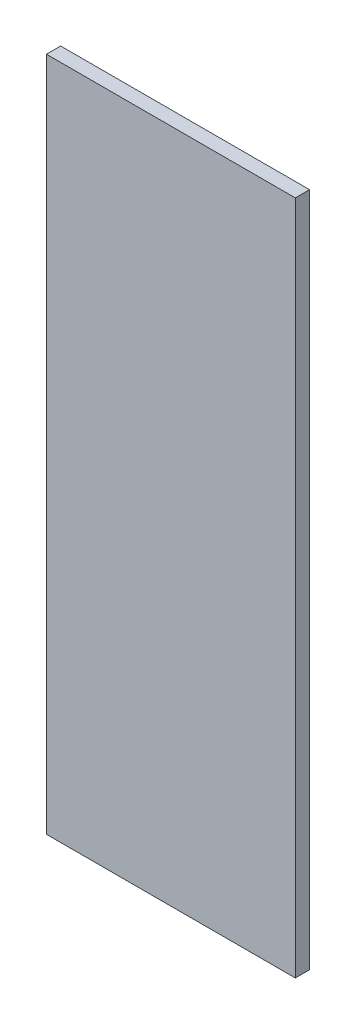
ISO-10303-21;
HEADER;
FILE_DESCRIPTION(('STEP AP214'),'2;1');
FILE_NAME('part.step','',(''),(''),'','','');
FILE_SCHEMA(('AUTOMOTIVE_DESIGN { 1 0 10303 214 1 1 1 1 }'));
ENDSEC;
DATA;
#1=APPLICATION_CONTEXT('core data for automotive mechanical design processes');
#2=APPLICATION_PROTOCOL_DEFINITION('international standard','automotive_design',2000,#1);
#3=PRODUCT_CONTEXT('',#1,'mechanical');
#4=PRODUCT('Part','Part','',(#3));
#5=PRODUCT_RELATED_PRODUCT_CATEGORY('part','',(#4));
#6=PRODUCT_DEFINITION_FORMATION('','',#4);
#7=PRODUCT_DEFINITION_CONTEXT('part definition',#1,'design');
#8=PRODUCT_DEFINITION('design','',#6,#7);
#9=PRODUCT_DEFINITION_SHAPE('','',#8);
#10=(LENGTH_UNIT() NAMED_UNIT(*) SI_UNIT(.MILLI.,.METRE.));
#11=(NAMED_UNIT(*) PLANE_ANGLE_UNIT() SI_UNIT($,.RADIAN.));
#12=(NAMED_UNIT(*) SI_UNIT($,.STERADIAN.) SOLID_ANGLE_UNIT());
#13=UNCERTAINTY_MEASURE_WITH_UNIT(LENGTH_MEASURE(1.E-05),#10,'distance_accuracy_value','');
#14=(GEOMETRIC_REPRESENTATION_CONTEXT(3) GLOBAL_UNCERTAINTY_ASSIGNED_CONTEXT((#13)) GLOBAL_UNIT_ASSIGNED_CONTEXT((#10,
#11,#12)) REPRESENTATION_CONTEXT('',''));
#15=CARTESIAN_POINT('',(0.,0.,0.));
#16=DIRECTION('',(0.,0.,1.));
#17=DIRECTION('',(1.,0.,0.));
#18=AXIS2_PLACEMENT_3D('',#15,#16,#17);
#19=CARTESIAN_POINT('',(0.,0.,0.2));
#20=DIRECTION('',(1.,0.,0.));
#21=DIRECTION('',(0.,0.,-1.));
#22=AXIS2_PLACEMENT_3D('',#19,#20,#21);
#23=PLANE('',#22);
#24=DIRECTION('',(0.,-1.,0.));
#25=VECTOR('',#24,1.);
#26=CARTESIAN_POINT('',(0.,0.,0.));
#27=LINE('',#26,#25);
#28=CARTESIAN_POINT('',(0.,9.5,0.));
#29=VERTEX_POINT('',#28);
#30=CARTESIAN_POINT('',(0.,0.,0.));
#31=VERTEX_POINT('',#30);
#32=EDGE_CURVE('E95',#29,#31,#27,.T.);
#33=ORIENTED_EDGE('',*,*,#32,.T.);
#34=DIRECTION('',(0.,0.,-1.));
#35=VECTOR('',#34,1.);
#36=CARTESIAN_POINT('',(0.,0.,0.2));
#37=LINE('',#36,#35);
#38=CARTESIAN_POINT('',(0.,0.,0.2));
#39=VERTEX_POINT('',#38);
#40=EDGE_CURVE('E11',#39,#31,#37,.T.);
#41=ORIENTED_EDGE('',*,*,#40,.F.);
#42=DIRECTION('',(0.,-1.,0.));
#43=VECTOR('',#42,1.);
#44=CARTESIAN_POINT('',(0.,0.,0.2));
#45=LINE('',#44,#43);
#46=CARTESIAN_POINT('',(0.,9.5,0.2));
#47=VERTEX_POINT('',#46);
#48=EDGE_CURVE('E83',#47,#39,#45,.T.);
#49=ORIENTED_EDGE('',*,*,#48,.F.);
#50=DIRECTION('',(0.,0.,-1.));
#51=VECTOR('',#50,1.);
#52=CARTESIAN_POINT('',(0.,9.5,0.2));
#53=LINE('',#52,#51);
#54=EDGE_CURVE('E91',#47,#29,#53,.T.);
#55=ORIENTED_EDGE('',*,*,#54,.T.);
#56=EDGE_LOOP('',(#33,#41,#49,#55));
#57=FACE_BOUND('',#56,.T.);
#58=ADVANCED_FACE('F32',(#57),#23,.F.);
#59=CARTESIAN_POINT('',(0.,0.,0.2));
#60=DIRECTION('',(0.,1.,0.));
#61=DIRECTION('',(0.,0.,1.));
#62=AXIS2_PLACEMENT_3D('',#59,#60,#61);
#63=PLANE('',#62);
#64=DIRECTION('',(1.,0.,0.));
#65=VECTOR('',#64,1.);
#66=CARTESIAN_POINT('',(0.,0.,0.));
#67=LINE('',#66,#65);
#68=CARTESIAN_POINT('',(3.5,0.,0.));
#69=VERTEX_POINT('',#68);
#70=EDGE_CURVE('E87',#31,#69,#67,.T.);
#71=ORIENTED_EDGE('',*,*,#70,.T.);
#72=DIRECTION('',(0.,0.,-1.));
#73=VECTOR('',#72,1.);
#74=CARTESIAN_POINT('',(3.5,0.,0.2));
#75=LINE('',#74,#73);
#76=CARTESIAN_POINT('',(3.5,0.,0.2));
#77=VERTEX_POINT('',#76);
#78=EDGE_CURVE('E40',#77,#69,#75,.T.);
#79=ORIENTED_EDGE('',*,*,#78,.F.);
#80=DIRECTION('',(1.,0.,0.));
#81=VECTOR('',#80,1.);
#82=CARTESIAN_POINT('',(0.,0.,0.2));
#83=LINE('',#82,#81);
#84=EDGE_CURVE('E78',#39,#77,#83,.T.);
#85=ORIENTED_EDGE('',*,*,#84,.F.);
#86=ORIENTED_EDGE('',*,*,#40,.T.);
#87=EDGE_LOOP('',(#71,#79,#85,#86));
#88=FACE_BOUND('',#87,.T.);
#89=ADVANCED_FACE('F86',(#88),#63,.F.);
#90=CARTESIAN_POINT('',(3.5,0.,0.2));
#91=DIRECTION('',(-1.,0.,0.));
#92=DIRECTION('',(0.,0.,1.));
#93=AXIS2_PLACEMENT_3D('',#90,#91,#92);
#94=PLANE('',#93);
#95=DIRECTION('',(0.,1.,0.));
#96=VECTOR('',#95,1.);
#97=CARTESIAN_POINT('',(3.5,0.,0.));
#98=LINE('',#97,#96);
#99=CARTESIAN_POINT('',(3.5,9.5,0.));
#100=VERTEX_POINT('',#99);
#101=EDGE_CURVE('E65',#69,#100,#98,.T.);
#102=ORIENTED_EDGE('',*,*,#101,.T.);
#103=DIRECTION('',(0.,0.,-1.));
#104=VECTOR('',#103,1.);
#105=CARTESIAN_POINT('',(3.5,9.5,0.2));
#106=LINE('',#105,#104);
#107=CARTESIAN_POINT('',(3.5,9.5,0.2));
#108=VERTEX_POINT('',#107);
#109=EDGE_CURVE('E88',#108,#100,#106,.T.);
#110=ORIENTED_EDGE('',*,*,#109,.F.);
#111=DIRECTION('',(0.,1.,0.));
#112=VECTOR('',#111,1.);
#113=CARTESIAN_POINT('',(3.5,0.,0.2));
#114=LINE('',#113,#112);
#115=EDGE_CURVE('E81',#77,#108,#114,.T.);
#116=ORIENTED_EDGE('',*,*,#115,.F.);
#117=ORIENTED_EDGE('',*,*,#78,.T.);
#118=EDGE_LOOP('',(#102,#110,#116,#117));
#119=FACE_BOUND('',#118,.T.);
#120=ADVANCED_FACE('F89',(#119),#94,.F.);
#121=CARTESIAN_POINT('',(0.,9.5,0.2));
#122=DIRECTION('',(0.,-1.,0.));
#123=DIRECTION('',(0.,0.,-1.));
#124=AXIS2_PLACEMENT_3D('',#121,#122,#123);
#125=PLANE('',#124);
#126=DIRECTION('',(-1.,0.,0.));
#127=VECTOR('',#126,1.);
#128=CARTESIAN_POINT('',(0.,9.5,0.));
#129=LINE('',#128,#127);
#130=EDGE_CURVE('E71',#100,#29,#129,.T.);
#131=ORIENTED_EDGE('',*,*,#130,.T.);
#132=ORIENTED_EDGE('',*,*,#54,.F.);
#133=DIRECTION('',(-1.,0.,0.));
#134=VECTOR('',#133,1.);
#135=CARTESIAN_POINT('',(0.,9.5,0.2));
#136=LINE('',#135,#134);
#137=EDGE_CURVE('E48',#108,#47,#136,.T.);
#138=ORIENTED_EDGE('',*,*,#137,.F.);
#139=ORIENTED_EDGE('',*,*,#109,.T.);
#140=EDGE_LOOP('',(#131,#132,#138,#139));
#141=FACE_BOUND('',#140,.T.);
#142=ADVANCED_FACE('F102',(#141),#125,.F.);
#143=CARTESIAN_POINT('',(0.,0.,0.2));
#144=DIRECTION('',(0.,0.,-1.));
#145=DIRECTION('',(-1.,0.,0.));
#146=AXIS2_PLACEMENT_3D('',#143,#144,#145);
#147=PLANE('',#146);
#148=ORIENTED_EDGE('',*,*,#48,.T.);
#149=ORIENTED_EDGE('',*,*,#84,.T.);
#150=ORIENTED_EDGE('',*,*,#115,.T.);
#151=ORIENTED_EDGE('',*,*,#137,.T.);
#152=EDGE_LOOP('',(#148,#149,#150,#151));
#153=FACE_BOUND('',#152,.T.);
#154=ADVANCED_FACE('F79',(#153),#147,.F.);
#155=CARTESIAN_POINT('',(0.,0.,0.));
#156=DIRECTION('',(0.,0.,-1.));
#157=DIRECTION('',(-1.,0.,0.));
#158=AXIS2_PLACEMENT_3D('',#155,#156,#157);
#159=PLANE('',#158);
#160=ORIENTED_EDGE('',*,*,#32,.F.);
#161=ORIENTED_EDGE('',*,*,#130,.F.);
#162=ORIENTED_EDGE('',*,*,#101,.F.);
#163=ORIENTED_EDGE('',*,*,#70,.F.);
#164=EDGE_LOOP('',(#160,#161,#162,#163));
#165=FACE_BOUND('',#164,.T.);
#166=ADVANCED_FACE('F105',(#165),#159,.T.);
#167=CLOSED_SHELL('',(#58,#89,#120,#142,#154,#166));
#168=MANIFOLD_SOLID_BREP('B2',#167);
#169=ADVANCED_BREP_SHAPE_REPRESENTATION('',(#18,#168),#14);
#170=SHAPE_DEFINITION_REPRESENTATION(#9,#169);
ENDSEC;
END-ISO-10303-21;
